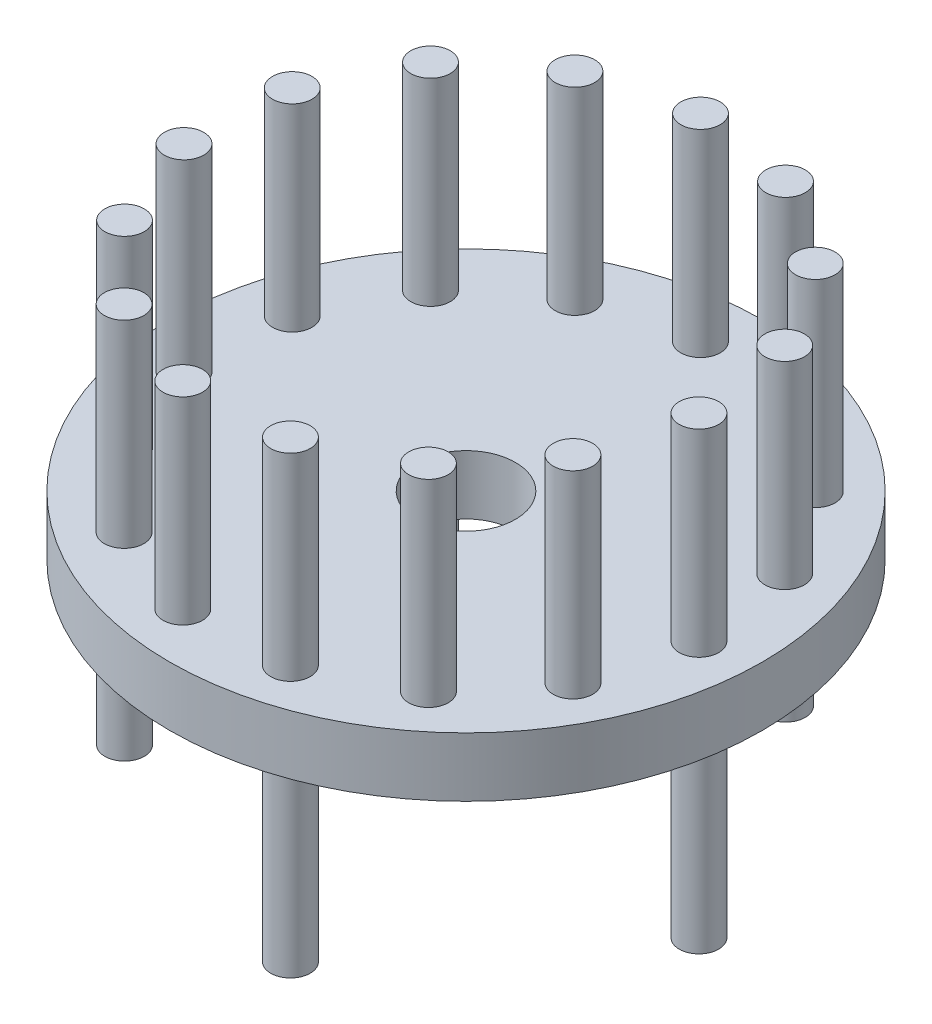
ISO-10303-21;
HEADER;
FILE_DESCRIPTION(('STEP AP214'),'2;1');
FILE_NAME('part.step','',(''),(''),'','','');
FILE_SCHEMA(('AUTOMOTIVE_DESIGN { 1 0 10303 214 1 1 1 1 }'));
ENDSEC;
DATA;
#1=APPLICATION_CONTEXT('core data for automotive mechanical design processes');
#2=APPLICATION_PROTOCOL_DEFINITION('international standard','automotive_design',2000,#1);
#3=PRODUCT_CONTEXT('',#1,'mechanical');
#4=PRODUCT('Part','Part','',(#3));
#5=PRODUCT_RELATED_PRODUCT_CATEGORY('part','',(#4));
#6=PRODUCT_DEFINITION_FORMATION('','',#4);
#7=PRODUCT_DEFINITION_CONTEXT('part definition',#1,'design');
#8=PRODUCT_DEFINITION('design','',#6,#7);
#9=PRODUCT_DEFINITION_SHAPE('','',#8);
#10=(LENGTH_UNIT() NAMED_UNIT(*) SI_UNIT(.MILLI.,.METRE.));
#11=(NAMED_UNIT(*) PLANE_ANGLE_UNIT() SI_UNIT($,.RADIAN.));
#12=(NAMED_UNIT(*) SI_UNIT($,.STERADIAN.) SOLID_ANGLE_UNIT());
#13=UNCERTAINTY_MEASURE_WITH_UNIT(LENGTH_MEASURE(1.E-05),#10,'distance_accuracy_value','');
#14=(GEOMETRIC_REPRESENTATION_CONTEXT(3) GLOBAL_UNCERTAINTY_ASSIGNED_CONTEXT((#13)) GLOBAL_UNIT_ASSIGNED_CONTEXT((#10,
#11,#12)) REPRESENTATION_CONTEXT('',''));
#15=CARTESIAN_POINT('',(0.,0.,0.));
#16=DIRECTION('',(0.,0.,1.));
#17=DIRECTION('',(1.,0.,0.));
#18=AXIS2_PLACEMENT_3D('',#15,#16,#17);
#19=CARTESIAN_POINT('',(0.,3.,0.));
#20=DIRECTION('',(0.,1.,0.));
#21=DIRECTION('',(0.,0.,1.));
#22=AXIS2_PLACEMENT_3D('',#19,#20,#21);
#23=PLANE('',#22);
#24=CARTESIAN_POINT('',(11.1206882965066,3.,5.70791483923351));
#25=DIRECTION('',(0.,1.,0.));
#26=DIRECTION('',(-0.406736643075789,0.,0.913545457642606));
#27=AXIS2_PLACEMENT_3D('',#24,#25,#26);
#28=CIRCLE('',#27,1.);
#29=CARTESIAN_POINT('',(10.7139516534308,3.,6.62146029687612));
#30=VERTEX_POINT('',#29);
#31=EDGE_CURVE('E152',#30,#30,#28,.T.);
#32=ORIENTED_EDGE('',*,*,#31,.F.);
#33=EDGE_LOOP('',(#32));
#34=FACE_BOUND('',#33,.T.);
#35=CARTESIAN_POINT('',(7.83763615846041,3.,9.73763110040599));
#36=DIRECTION('',(0.,1.,0.));
#37=DIRECTION('',(-0.743144825477386,0.,0.669130606358867));
#38=AXIS2_PLACEMENT_3D('',#35,#36,#37);
#39=CIRCLE('',#38,1.);
#40=CARTESIAN_POINT('',(7.09449133298302,3.,10.4067617067649));
#41=VERTEX_POINT('',#40);
#42=EDGE_CURVE('E146',#41,#41,#39,.T.);
#43=ORIENTED_EDGE('',*,*,#42,.F.);
#44=EDGE_LOOP('',(#43));
#45=FACE_BOUND('',#44,.T.);
#46=CARTESIAN_POINT('',(3.19938552592725,3.,12.0836224807169));
#47=DIRECTION('',(0.,1.,0.));
#48=DIRECTION('',(-0.95105651629515,0.,0.309016994374957));
#49=AXIS2_PLACEMENT_3D('',#46,#47,#48);
#50=CIRCLE('',#49,1.);
#51=CARTESIAN_POINT('',(2.2483290096321,3.,12.3926394750919));
#52=VERTEX_POINT('',#51);
#53=EDGE_CURVE('E140',#52,#52,#50,.T.);
#54=ORIENTED_EDGE('',*,*,#53,.F.);
#55=EDGE_LOOP('',(#54));
#56=FACE_BOUND('',#55,.T.);
#57=CARTESIAN_POINT('',(-1.99206792954376,3.,12.3402457578479));
#58=DIRECTION('',(0.,1.,0.));
#59=DIRECTION('',(-0.994521895368274,0.,-0.104528463267644));
#60=AXIS2_PLACEMENT_3D('',#57,#58,#59);
#61=CIRCLE('',#60,1.);
#62=CARTESIAN_POINT('',(-2.98658982491203,3.,12.2357172945803));
#63=VERTEX_POINT('',#62);
#64=EDGE_CURVE('E134',#63,#63,#61,.T.);
#65=ORIENTED_EDGE('',*,*,#64,.F.);
#66=EDGE_LOOP('',(#65));
#67=FACE_BOUND('',#66,.T.);
#68=CARTESIAN_POINT('',(-6.83907474262765,3.,10.4631284358337));
#69=DIRECTION('',(0.,1.,0.));
#70=DIRECTION('',(-0.866025403784443,0.,-0.499999999999992));
#71=AXIS2_PLACEMENT_3D('',#68,#69,#70);
#72=CIRCLE('',#71,1.);
#73=CARTESIAN_POINT('',(-7.70510014641209,3.,9.96312843583374));
#74=VERTEX_POINT('',#73);
#75=EDGE_CURVE('E128',#74,#74,#72,.T.);
#76=ORIENTED_EDGE('',*,*,#75,.F.);
#77=EDGE_LOOP('',(#76));
#78=FACE_BOUND('',#77,.T.);
#79=CARTESIAN_POINT('',(-10.5035434016677,3.,6.77684115272617));
#80=DIRECTION('',(0.,1.,0.));
#81=DIRECTION('',(-0.58778525229248,0.,-0.809016994374943));
#82=AXIS2_PLACEMENT_3D('',#79,#80,#81);
#83=CIRCLE('',#82,1.);
#84=CARTESIAN_POINT('',(-11.0913286539602,3.,5.96782415835123));
#85=VERTEX_POINT('',#84);
#86=EDGE_CURVE('E122',#85,#85,#83,.T.);
#87=ORIENTED_EDGE('',*,*,#86,.F.);
#88=EDGE_LOOP('',(#87));
#89=FACE_BOUND('',#88,.T.);
#90=CARTESIAN_POINT('',(-12.3518539848632,3.,1.91877646864314));
#91=DIRECTION('',(0.,1.,0.));
#92=DIRECTION('',(-0.207911690817766,0.,-0.978147600733804));
#93=AXIS2_PLACEMENT_3D('',#90,#91,#92);
#94=CIRCLE('',#93,1.);
#95=CARTESIAN_POINT('',(-12.559765675681,3.,0.940628867909331));
#96=VERTEX_POINT('',#95);
#97=EDGE_CURVE('E116',#96,#96,#94,.T.);
#98=ORIENTED_EDGE('',*,*,#97,.F.);
#99=EDGE_LOOP('',(#98));
#100=FACE_BOUND('',#99,.T.);
#101=CARTESIAN_POINT('',(-12.0644168010052,3.,-3.27106209840528));
#102=DIRECTION('',(0.,1.,0.));
#103=DIRECTION('',(0.207911690817753,0.,-0.978147600733807));
#104=AXIS2_PLACEMENT_3D('',#101,#102,#103);
#105=CIRCLE('',#104,1.);
#106=CARTESIAN_POINT('',(-11.8565051101874,3.,-4.24920969913908));
#107=VERTEX_POINT('',#106);
#108=EDGE_CURVE('E110',#107,#107,#105,.T.);
#109=ORIENTED_EDGE('',*,*,#108,.F.);
#110=EDGE_LOOP('',(#109));
#111=FACE_BOUND('',#110,.T.);
#112=CARTESIAN_POINT('',(-9.69093235046752,3.,-7.89530431197316));
#113=DIRECTION('',(0.,1.,0.));
#114=DIRECTION('',(0.587785252292469,0.,-0.80901699437495));
#115=AXIS2_PLACEMENT_3D('',#112,#113,#114);
#116=CIRCLE('',#115,1.);
#117=CARTESIAN_POINT('',(-9.10314709817505,3.,-8.70432130634811));
#118=VERTEX_POINT('',#117);
#119=EDGE_CURVE('E104',#118,#118,#116,.T.);
#120=ORIENTED_EDGE('',*,*,#119,.F.);
#121=EDGE_LOOP('',(#120));
#122=FACE_BOUND('',#121,.T.);
#123=CARTESIAN_POINT('',(-5.64179765717748,3.,-11.154376683413));
#124=DIRECTION('',(0.,1.,0.));
#125=DIRECTION('',(0.866025403784436,0.,-0.500000000000004));
#126=AXIS2_PLACEMENT_3D('',#123,#124,#125);
#127=CIRCLE('',#126,1.);
#128=CARTESIAN_POINT('',(-4.77577225339304,3.,-11.654376683413));
#129=VERTEX_POINT('',#128);
#130=EDGE_CURVE('E98',#129,#129,#127,.T.);
#131=ORIENTED_EDGE('',*,*,#130,.F.);
#132=EDGE_LOOP('',(#131));
#133=FACE_BOUND('',#132,.T.);
#134=CARTESIAN_POINT('',(-0.617144894838775,3.,-12.4847559919597));
#135=DIRECTION('',(0.,1.,0.));
#136=DIRECTION('',(0.994521895368273,0.,-0.104528463267657));
#137=AXIS2_PLACEMENT_3D('',#134,#135,#136);
#138=CIRCLE('',#137,1.);
#139=CARTESIAN_POINT('',(0.377377000529499,3.,-12.5892844552274));
#140=VERTEX_POINT('',#139);
#141=EDGE_CURVE('E92',#140,#140,#138,.T.);
#142=ORIENTED_EDGE('',*,*,#141,.F.);
#143=EDGE_LOOP('',(#142));
#144=FACE_BOUND('',#143,.T.);
#145=CARTESIAN_POINT('',(4.51421782640291,3.,-11.6564075690491));
#146=DIRECTION('',(0.,1.,0.));
#147=DIRECTION('',(0.951056516295154,0.,0.309016994374945));
#148=AXIS2_PLACEMENT_3D('',#145,#146,#147);
#149=CIRCLE('',#148,1.);
#150=CARTESIAN_POINT('',(5.46527434269807,3.,-11.3473905746742));
#151=VERTEX_POINT('',#150);
#152=EDGE_CURVE('E86',#151,#151,#149,.T.);
#153=ORIENTED_EDGE('',*,*,#152,.F.);
#154=EDGE_LOOP('',(#153));
#155=FACE_BOUND('',#154,.T.);
#156=CARTESIAN_POINT('',(8.86503127507804,3.,-8.81256038231161));
#157=DIRECTION('',(0.,1.,0.));
#158=DIRECTION('',(0.743144825477395,0.,0.669130606358857));
#159=AXIS2_PLACEMENT_3D('',#156,#157,#158);
#160=CIRCLE('',#159,1.);
#161=CARTESIAN_POINT('',(9.60817610055544,3.,-8.14342977595276));
#162=VERTEX_POINT('',#161);
#163=EDGE_CURVE('E80',#162,#162,#160,.T.);
#164=ORIENTED_EDGE('',*,*,#163,.F.);
#165=EDGE_LOOP('',(#164));
#166=FACE_BOUND('',#165,.T.);
#167=CARTESIAN_POINT('',(11.6830002800114,3.,-4.44494144587468));
#168=DIRECTION('',(0.,1.,0.));
#169=DIRECTION('',(0.406736643075801,0.,0.913545457642601));
#170=AXIS2_PLACEMENT_3D('',#167,#168,#169);
#171=CIRCLE('',#170,1.);
#172=CARTESIAN_POINT('',(12.0897369230872,3.,-3.53139598823208));
#173=VERTEX_POINT('',#172);
#174=EDGE_CURVE('E74',#173,#173,#171,.T.);
#175=ORIENTED_EDGE('',*,*,#174,.F.);
#176=EDGE_LOOP('',(#175));
#177=FACE_BOUND('',#176,.T.);
#178=CARTESIAN_POINT('',(12.4808723998052,3.,0.691248247579312));
#179=DIRECTION('',(0.,1.,0.));
#180=DIRECTION('',(0.,0.,1.));
#181=AXIS2_PLACEMENT_3D('',#178,#179,#180);
#182=CIRCLE('',#181,1.);
#183=CARTESIAN_POINT('',(12.4808723998052,3.,1.69124824757931));
#184=VERTEX_POINT('',#183);
#185=EDGE_CURVE('E68',#184,#184,#182,.T.);
#186=ORIENTED_EDGE('',*,*,#185,.F.);
#187=EDGE_LOOP('',(#186));
#188=FACE_BOUND('',#187,.T.);
#189=CARTESIAN_POINT('',(0.,3.,0.));
#190=DIRECTION('',(0.,1.,0.));
#191=DIRECTION('',(0.,0.,1.));
#192=AXIS2_PLACEMENT_3D('',#189,#190,#191);
#193=CIRCLE('',#192,15.);
#194=CARTESIAN_POINT('',(0.,3.,15.));
#195=VERTEX_POINT('',#194);
#196=EDGE_CURVE('E55',#195,#195,#193,.T.);
#197=ORIENTED_EDGE('',*,*,#196,.T.);
#198=EDGE_LOOP('',(#197));
#199=FACE_BOUND('',#198,.T.);
#200=CARTESIAN_POINT('',(0.,3.,0.));
#201=DIRECTION('',(0.,1.,0.));
#202=DIRECTION('',(0.,0.,1.));
#203=AXIS2_PLACEMENT_3D('',#200,#201,#202);
#204=CIRCLE('',#203,2.5);
#205=CARTESIAN_POINT('',(0.,3.,2.5));
#206=VERTEX_POINT('',#205);
#207=EDGE_CURVE('E59',#206,#206,#204,.T.);
#208=ORIENTED_EDGE('',*,*,#207,.F.);
#209=EDGE_LOOP('',(#208));
#210=FACE_BOUND('',#209,.T.);
#211=ADVANCED_FACE('F32',(#34,#45,#56,#67,#78,#89,#100,#111,#122,#133,#144,#155,#166,#177,#188,
#199,#210),#23,.T.);
#212=CARTESIAN_POINT('',(0.,0.,0.));
#213=DIRECTION('',(0.,1.,0.));
#214=DIRECTION('',(0.,0.,1.));
#215=AXIS2_PLACEMENT_3D('',#212,#213,#214);
#216=PLANE('',#215);
#217=CARTESIAN_POINT('',(4.51421782640307,0.,-11.6564075690491));
#218=DIRECTION('',(0.,1.,0.));
#219=DIRECTION('',(0.,0.,1.));
#220=AXIS2_PLACEMENT_3D('',#217,#218,#219);
#221=CIRCLE('',#220,1.);
#222=CARTESIAN_POINT('',(4.51421782640307,0.,-10.6564075690491));
#223=VERTEX_POINT('',#222);
#224=EDGE_CURVE('E10',#223,#223,#221,.F.);
#225=ORIENTED_EDGE('',*,*,#224,.F.);
#226=EDGE_LOOP('',(#225));
#227=FACE_BOUND('',#226,.T.);
#228=CARTESIAN_POINT('',(-9.69093235046741,0.,-7.8953043119733));
#229=DIRECTION('',(0.,1.,0.));
#230=DIRECTION('',(0.,0.,1.));
#231=AXIS2_PLACEMENT_3D('',#228,#229,#230);
#232=CIRCLE('',#231,1.);
#233=CARTESIAN_POINT('',(-9.69093235046741,0.,-6.8953043119733));
#234=VERTEX_POINT('',#233);
#235=EDGE_CURVE('E39',#234,#234,#232,.F.);
#236=ORIENTED_EDGE('',*,*,#235,.F.);
#237=EDGE_LOOP('',(#236));
#238=FACE_BOUND('',#237,.T.);
#239=CARTESIAN_POINT('',(-10.5035434016678,0.,6.77684115272602));
#240=DIRECTION('',(0.,1.,0.));
#241=DIRECTION('',(0.,0.,1.));
#242=AXIS2_PLACEMENT_3D('',#239,#240,#241);
#243=CIRCLE('',#242,1.);
#244=CARTESIAN_POINT('',(-10.5035434016678,0.,7.77684115272602));
#245=VERTEX_POINT('',#244);
#246=EDGE_CURVE('E43',#245,#245,#243,.F.);
#247=ORIENTED_EDGE('',*,*,#246,.F.);
#248=EDGE_LOOP('',(#247));
#249=FACE_BOUND('',#248,.T.);
#250=CARTESIAN_POINT('',(3.19938552592709,0.,12.083622480717));
#251=DIRECTION('',(0.,1.,0.));
#252=DIRECTION('',(0.,0.,1.));
#253=AXIS2_PLACEMENT_3D('',#250,#251,#252);
#254=CIRCLE('',#253,1.);
#255=CARTESIAN_POINT('',(3.19938552592709,0.,13.083622480717));
#256=VERTEX_POINT('',#255);
#257=EDGE_CURVE('E47',#256,#256,#254,.F.);
#258=ORIENTED_EDGE('',*,*,#257,.F.);
#259=EDGE_LOOP('',(#258));
#260=FACE_BOUND('',#259,.T.);
#261=CARTESIAN_POINT('',(12.4808723998052,0.,0.691248247579312));
#262=DIRECTION('',(0.,1.,0.));
#263=DIRECTION('',(0.,0.,1.));
#264=AXIS2_PLACEMENT_3D('',#261,#262,#263);
#265=CIRCLE('',#264,1.);
#266=CARTESIAN_POINT('',(12.4808723998052,0.,1.69124824757931));
#267=VERTEX_POINT('',#266);
#268=EDGE_CURVE('E52',#267,#267,#265,.F.);
#269=ORIENTED_EDGE('',*,*,#268,.F.);
#270=EDGE_LOOP('',(#269));
#271=FACE_BOUND('',#270,.T.);
#272=CARTESIAN_POINT('',(0.,0.,0.));
#273=DIRECTION('',(0.,1.,0.));
#274=DIRECTION('',(0.,0.,1.));
#275=AXIS2_PLACEMENT_3D('',#272,#273,#274);
#276=CIRCLE('',#275,15.);
#277=CARTESIAN_POINT('',(0.,0.,15.));
#278=VERTEX_POINT('',#277);
#279=EDGE_CURVE('E56',#278,#278,#276,.T.);
#280=ORIENTED_EDGE('',*,*,#279,.F.);
#281=EDGE_LOOP('',(#280));
#282=FACE_BOUND('',#281,.T.);
#283=CARTESIAN_POINT('',(0.,0.,0.));
#284=DIRECTION('',(0.,1.,0.));
#285=DIRECTION('',(0.,0.,1.));
#286=AXIS2_PLACEMENT_3D('',#283,#284,#285);
#287=CIRCLE('',#286,2.5);
#288=CARTESIAN_POINT('',(0.,0.,2.5));
#289=VERTEX_POINT('',#288);
#290=EDGE_CURVE('E62',#289,#289,#287,.T.);
#291=ORIENTED_EDGE('',*,*,#290,.T.);
#292=EDGE_LOOP('',(#291));
#293=FACE_BOUND('',#292,.T.);
#294=ADVANCED_FACE('F188',(#227,#238,#249,#260,#271,#282,#293),#216,.F.);
#295=CARTESIAN_POINT('',(0.,3.,0.));
#296=DIRECTION('',(0.,-1.,0.));
#297=DIRECTION('',(0.,0.,-1.));
#298=AXIS2_PLACEMENT_3D('',#295,#296,#297);
#299=CYLINDRICAL_SURFACE('',#298,15.);
#300=ORIENTED_EDGE('',*,*,#196,.F.);
#301=EDGE_LOOP('',(#300));
#302=FACE_BOUND('',#301,.T.);
#303=ORIENTED_EDGE('',*,*,#279,.T.);
#304=EDGE_LOOP('',(#303));
#305=FACE_BOUND('',#304,.T.);
#306=ADVANCED_FACE('F34',(#302,#305),#299,.T.);
#307=CARTESIAN_POINT('',(0.,3.,0.));
#308=DIRECTION('',(0.,-1.,0.));
#309=DIRECTION('',(0.,0.,-1.));
#310=AXIS2_PLACEMENT_3D('',#307,#308,#309);
#311=CYLINDRICAL_SURFACE('',#310,2.5);
#312=ORIENTED_EDGE('',*,*,#207,.T.);
#313=EDGE_LOOP('',(#312));
#314=FACE_BOUND('',#313,.T.);
#315=ORIENTED_EDGE('',*,*,#290,.F.);
#316=EDGE_LOOP('',(#315));
#317=FACE_BOUND('',#316,.T.);
#318=ADVANCED_FACE('F198',(#314,#317),#311,.F.);
#319=CARTESIAN_POINT('',(12.4808723998052,13.,0.691248247579312));
#320=DIRECTION('',(0.,-1.,0.));
#321=DIRECTION('',(0.,0.,-1.));
#322=AXIS2_PLACEMENT_3D('',#319,#320,#321);
#323=CYLINDRICAL_SURFACE('',#322,1.);
#324=CARTESIAN_POINT('',(12.4808723998052,13.,0.691248247579312));
#325=DIRECTION('',(0.,1.,0.));
#326=DIRECTION('',(0.,0.,1.));
#327=AXIS2_PLACEMENT_3D('',#324,#325,#326);
#328=CIRCLE('',#327,1.);
#329=CARTESIAN_POINT('',(12.4808723998052,13.,1.69124824757931));
#330=VERTEX_POINT('',#329);
#331=EDGE_CURVE('E65',#330,#330,#328,.T.);
#332=ORIENTED_EDGE('',*,*,#331,.F.);
#333=EDGE_LOOP('',(#332));
#334=FACE_BOUND('',#333,.T.);
#335=ORIENTED_EDGE('',*,*,#185,.T.);
#336=EDGE_LOOP('',(#335));
#337=FACE_BOUND('',#336,.T.);
#338=ADVANCED_FACE('F201',(#334,#337),#323,.T.);
#339=CARTESIAN_POINT('',(12.4808723998052,13.,0.691248247579312));
#340=DIRECTION('',(0.,1.,0.));
#341=DIRECTION('',(0.,0.,1.));
#342=AXIS2_PLACEMENT_3D('',#339,#340,#341);
#343=PLANE('',#342);
#344=ORIENTED_EDGE('',*,*,#331,.T.);
#345=EDGE_LOOP('',(#344));
#346=FACE_BOUND('',#345,.T.);
#347=ADVANCED_FACE('F205',(#346),#343,.T.);
#348=CARTESIAN_POINT('',(11.6830002800114,13.,-4.44494144587468));
#349=DIRECTION('',(0.,-1.,0.));
#350=DIRECTION('',(0.,0.,-1.));
#351=AXIS2_PLACEMENT_3D('',#348,#349,#350);
#352=CYLINDRICAL_SURFACE('',#351,1.);
#353=CARTESIAN_POINT('',(11.6830002800114,13.,-4.44494144587468));
#354=DIRECTION('',(0.,1.,0.));
#355=DIRECTION('',(0.406736643075801,0.,0.913545457642601));
#356=AXIS2_PLACEMENT_3D('',#353,#354,#355);
#357=CIRCLE('',#356,1.);
#358=CARTESIAN_POINT('',(12.0897369230872,13.,-3.53139598823208));
#359=VERTEX_POINT('',#358);
#360=EDGE_CURVE('E71',#359,#359,#357,.T.);
#361=ORIENTED_EDGE('',*,*,#360,.F.);
#362=EDGE_LOOP('',(#361));
#363=FACE_BOUND('',#362,.T.);
#364=ORIENTED_EDGE('',*,*,#174,.T.);
#365=EDGE_LOOP('',(#364));
#366=FACE_BOUND('',#365,.T.);
#367=ADVANCED_FACE('F209',(#363,#366),#352,.T.);
#368=CARTESIAN_POINT('',(11.6830002800114,13.,-4.44494144587468));
#369=DIRECTION('',(0.,1.,0.));
#370=DIRECTION('',(0.406736643075801,0.,0.913545457642601));
#371=AXIS2_PLACEMENT_3D('',#368,#369,#370);
#372=PLANE('',#371);
#373=ORIENTED_EDGE('',*,*,#360,.T.);
#374=EDGE_LOOP('',(#373));
#375=FACE_BOUND('',#374,.T.);
#376=ADVANCED_FACE('F213',(#375),#372,.T.);
#377=CARTESIAN_POINT('',(8.86503127507804,13.,-8.81256038231161));
#378=DIRECTION('',(0.,-1.,0.));
#379=DIRECTION('',(0.,0.,-1.));
#380=AXIS2_PLACEMENT_3D('',#377,#378,#379);
#381=CYLINDRICAL_SURFACE('',#380,1.);
#382=CARTESIAN_POINT('',(8.86503127507804,13.,-8.81256038231161));
#383=DIRECTION('',(0.,1.,0.));
#384=DIRECTION('',(0.743144825477395,0.,0.669130606358857));
#385=AXIS2_PLACEMENT_3D('',#382,#383,#384);
#386=CIRCLE('',#385,1.);
#387=CARTESIAN_POINT('',(9.60817610055544,13.,-8.14342977595276));
#388=VERTEX_POINT('',#387);
#389=EDGE_CURVE('E77',#388,#388,#386,.T.);
#390=ORIENTED_EDGE('',*,*,#389,.F.);
#391=EDGE_LOOP('',(#390));
#392=FACE_BOUND('',#391,.T.);
#393=ORIENTED_EDGE('',*,*,#163,.T.);
#394=EDGE_LOOP('',(#393));
#395=FACE_BOUND('',#394,.T.);
#396=ADVANCED_FACE('F217',(#392,#395),#381,.T.);
#397=CARTESIAN_POINT('',(8.86503127507804,13.,-8.81256038231161));
#398=DIRECTION('',(0.,1.,0.));
#399=DIRECTION('',(0.743144825477395,0.,0.669130606358857));
#400=AXIS2_PLACEMENT_3D('',#397,#398,#399);
#401=PLANE('',#400);
#402=ORIENTED_EDGE('',*,*,#389,.T.);
#403=EDGE_LOOP('',(#402));
#404=FACE_BOUND('',#403,.T.);
#405=ADVANCED_FACE('F221',(#404),#401,.T.);
#406=CARTESIAN_POINT('',(4.51421782640291,13.,-11.6564075690491));
#407=DIRECTION('',(0.,-1.,0.));
#408=DIRECTION('',(0.,0.,-1.));
#409=AXIS2_PLACEMENT_3D('',#406,#407,#408);
#410=CYLINDRICAL_SURFACE('',#409,1.);
#411=CARTESIAN_POINT('',(4.51421782640291,13.,-11.6564075690491));
#412=DIRECTION('',(0.,1.,0.));
#413=DIRECTION('',(0.951056516295154,0.,0.309016994374945));
#414=AXIS2_PLACEMENT_3D('',#411,#412,#413);
#415=CIRCLE('',#414,1.);
#416=CARTESIAN_POINT('',(5.46527434269807,13.,-11.3473905746742));
#417=VERTEX_POINT('',#416);
#418=EDGE_CURVE('E83',#417,#417,#415,.T.);
#419=ORIENTED_EDGE('',*,*,#418,.F.);
#420=EDGE_LOOP('',(#419));
#421=FACE_BOUND('',#420,.T.);
#422=ORIENTED_EDGE('',*,*,#152,.T.);
#423=EDGE_LOOP('',(#422));
#424=FACE_BOUND('',#423,.T.);
#425=ADVANCED_FACE('F225',(#421,#424),#410,.T.);
#426=CARTESIAN_POINT('',(4.51421782640291,13.,-11.6564075690491));
#427=DIRECTION('',(0.,1.,0.));
#428=DIRECTION('',(0.951056516295154,0.,0.309016994374945));
#429=AXIS2_PLACEMENT_3D('',#426,#427,#428);
#430=PLANE('',#429);
#431=ORIENTED_EDGE('',*,*,#418,.T.);
#432=EDGE_LOOP('',(#431));
#433=FACE_BOUND('',#432,.T.);
#434=ADVANCED_FACE('F229',(#433),#430,.T.);
#435=CARTESIAN_POINT('',(-0.617144894838775,13.,-12.4847559919597));
#436=DIRECTION('',(0.,-1.,0.));
#437=DIRECTION('',(0.,0.,-1.));
#438=AXIS2_PLACEMENT_3D('',#435,#436,#437);
#439=CYLINDRICAL_SURFACE('',#438,1.);
#440=CARTESIAN_POINT('',(-0.617144894838775,13.,-12.4847559919597));
#441=DIRECTION('',(0.,1.,0.));
#442=DIRECTION('',(0.994521895368273,0.,-0.104528463267657));
#443=AXIS2_PLACEMENT_3D('',#440,#441,#442);
#444=CIRCLE('',#443,1.);
#445=CARTESIAN_POINT('',(0.377377000529499,13.,-12.5892844552274));
#446=VERTEX_POINT('',#445);
#447=EDGE_CURVE('E89',#446,#446,#444,.T.);
#448=ORIENTED_EDGE('',*,*,#447,.F.);
#449=EDGE_LOOP('',(#448));
#450=FACE_BOUND('',#449,.T.);
#451=ORIENTED_EDGE('',*,*,#141,.T.);
#452=EDGE_LOOP('',(#451));
#453=FACE_BOUND('',#452,.T.);
#454=ADVANCED_FACE('F233',(#450,#453),#439,.T.);
#455=CARTESIAN_POINT('',(-0.617144894838775,13.,-12.4847559919597));
#456=DIRECTION('',(0.,1.,0.));
#457=DIRECTION('',(0.994521895368273,0.,-0.104528463267657));
#458=AXIS2_PLACEMENT_3D('',#455,#456,#457);
#459=PLANE('',#458);
#460=ORIENTED_EDGE('',*,*,#447,.T.);
#461=EDGE_LOOP('',(#460));
#462=FACE_BOUND('',#461,.T.);
#463=ADVANCED_FACE('F237',(#462),#459,.T.);
#464=CARTESIAN_POINT('',(-5.64179765717748,13.,-11.154376683413));
#465=DIRECTION('',(0.,-1.,0.));
#466=DIRECTION('',(0.,0.,-1.));
#467=AXIS2_PLACEMENT_3D('',#464,#465,#466);
#468=CYLINDRICAL_SURFACE('',#467,1.);
#469=CARTESIAN_POINT('',(-5.64179765717748,13.,-11.154376683413));
#470=DIRECTION('',(0.,1.,0.));
#471=DIRECTION('',(0.866025403784436,0.,-0.500000000000004));
#472=AXIS2_PLACEMENT_3D('',#469,#470,#471);
#473=CIRCLE('',#472,1.);
#474=CARTESIAN_POINT('',(-4.77577225339304,13.,-11.654376683413));
#475=VERTEX_POINT('',#474);
#476=EDGE_CURVE('E95',#475,#475,#473,.T.);
#477=ORIENTED_EDGE('',*,*,#476,.F.);
#478=EDGE_LOOP('',(#477));
#479=FACE_BOUND('',#478,.T.);
#480=ORIENTED_EDGE('',*,*,#130,.T.);
#481=EDGE_LOOP('',(#480));
#482=FACE_BOUND('',#481,.T.);
#483=ADVANCED_FACE('F241',(#479,#482),#468,.T.);
#484=CARTESIAN_POINT('',(-5.64179765717748,13.,-11.154376683413));
#485=DIRECTION('',(0.,1.,0.));
#486=DIRECTION('',(0.866025403784436,0.,-0.500000000000004));
#487=AXIS2_PLACEMENT_3D('',#484,#485,#486);
#488=PLANE('',#487);
#489=ORIENTED_EDGE('',*,*,#476,.T.);
#490=EDGE_LOOP('',(#489));
#491=FACE_BOUND('',#490,.T.);
#492=ADVANCED_FACE('F245',(#491),#488,.T.);
#493=CARTESIAN_POINT('',(-9.69093235046752,13.,-7.89530431197316));
#494=DIRECTION('',(0.,-1.,0.));
#495=DIRECTION('',(0.,0.,-1.));
#496=AXIS2_PLACEMENT_3D('',#493,#494,#495);
#497=CYLINDRICAL_SURFACE('',#496,1.);
#498=CARTESIAN_POINT('',(-9.69093235046752,13.,-7.89530431197316));
#499=DIRECTION('',(0.,1.,0.));
#500=DIRECTION('',(0.587785252292469,0.,-0.80901699437495));
#501=AXIS2_PLACEMENT_3D('',#498,#499,#500);
#502=CIRCLE('',#501,1.);
#503=CARTESIAN_POINT('',(-9.10314709817505,13.,-8.70432130634811));
#504=VERTEX_POINT('',#503);
#505=EDGE_CURVE('E101',#504,#504,#502,.T.);
#506=ORIENTED_EDGE('',*,*,#505,.F.);
#507=EDGE_LOOP('',(#506));
#508=FACE_BOUND('',#507,.T.);
#509=ORIENTED_EDGE('',*,*,#119,.T.);
#510=EDGE_LOOP('',(#509));
#511=FACE_BOUND('',#510,.T.);
#512=ADVANCED_FACE('F249',(#508,#511),#497,.T.);
#513=CARTESIAN_POINT('',(-9.69093235046752,13.,-7.89530431197316));
#514=DIRECTION('',(0.,1.,0.));
#515=DIRECTION('',(0.587785252292469,0.,-0.80901699437495));
#516=AXIS2_PLACEMENT_3D('',#513,#514,#515);
#517=PLANE('',#516);
#518=ORIENTED_EDGE('',*,*,#505,.T.);
#519=EDGE_LOOP('',(#518));
#520=FACE_BOUND('',#519,.T.);
#521=ADVANCED_FACE('F253',(#520),#517,.T.);
#522=CARTESIAN_POINT('',(-12.0644168010052,13.,-3.27106209840528));
#523=DIRECTION('',(0.,-1.,0.));
#524=DIRECTION('',(0.,0.,-1.));
#525=AXIS2_PLACEMENT_3D('',#522,#523,#524);
#526=CYLINDRICAL_SURFACE('',#525,1.);
#527=CARTESIAN_POINT('',(-12.0644168010052,13.,-3.27106209840528));
#528=DIRECTION('',(0.,1.,0.));
#529=DIRECTION('',(0.207911690817753,0.,-0.978147600733807));
#530=AXIS2_PLACEMENT_3D('',#527,#528,#529);
#531=CIRCLE('',#530,1.);
#532=CARTESIAN_POINT('',(-11.8565051101874,13.,-4.24920969913908));
#533=VERTEX_POINT('',#532);
#534=EDGE_CURVE('E107',#533,#533,#531,.T.);
#535=ORIENTED_EDGE('',*,*,#534,.F.);
#536=EDGE_LOOP('',(#535));
#537=FACE_BOUND('',#536,.T.);
#538=ORIENTED_EDGE('',*,*,#108,.T.);
#539=EDGE_LOOP('',(#538));
#540=FACE_BOUND('',#539,.T.);
#541=ADVANCED_FACE('F257',(#537,#540),#526,.T.);
#542=CARTESIAN_POINT('',(-12.0644168010052,13.,-3.27106209840528));
#543=DIRECTION('',(0.,1.,0.));
#544=DIRECTION('',(0.207911690817753,0.,-0.978147600733807));
#545=AXIS2_PLACEMENT_3D('',#542,#543,#544);
#546=PLANE('',#545);
#547=ORIENTED_EDGE('',*,*,#534,.T.);
#548=EDGE_LOOP('',(#547));
#549=FACE_BOUND('',#548,.T.);
#550=ADVANCED_FACE('F261',(#549),#546,.T.);
#551=CARTESIAN_POINT('',(-12.3518539848632,13.,1.91877646864314));
#552=DIRECTION('',(0.,-1.,0.));
#553=DIRECTION('',(0.,0.,-1.));
#554=AXIS2_PLACEMENT_3D('',#551,#552,#553);
#555=CYLINDRICAL_SURFACE('',#554,1.);
#556=CARTESIAN_POINT('',(-12.3518539848632,13.,1.91877646864314));
#557=DIRECTION('',(0.,1.,0.));
#558=DIRECTION('',(-0.207911690817766,0.,-0.978147600733804));
#559=AXIS2_PLACEMENT_3D('',#556,#557,#558);
#560=CIRCLE('',#559,1.);
#561=CARTESIAN_POINT('',(-12.559765675681,13.,0.940628867909331));
#562=VERTEX_POINT('',#561);
#563=EDGE_CURVE('E113',#562,#562,#560,.T.);
#564=ORIENTED_EDGE('',*,*,#563,.F.);
#565=EDGE_LOOP('',(#564));
#566=FACE_BOUND('',#565,.T.);
#567=ORIENTED_EDGE('',*,*,#97,.T.);
#568=EDGE_LOOP('',(#567));
#569=FACE_BOUND('',#568,.T.);
#570=ADVANCED_FACE('F265',(#566,#569),#555,.T.);
#571=CARTESIAN_POINT('',(-12.3518539848632,13.,1.91877646864314));
#572=DIRECTION('',(0.,1.,0.));
#573=DIRECTION('',(-0.207911690817766,0.,-0.978147600733804));
#574=AXIS2_PLACEMENT_3D('',#571,#572,#573);
#575=PLANE('',#574);
#576=ORIENTED_EDGE('',*,*,#563,.T.);
#577=EDGE_LOOP('',(#576));
#578=FACE_BOUND('',#577,.T.);
#579=ADVANCED_FACE('F269',(#578),#575,.T.);
#580=CARTESIAN_POINT('',(-10.5035434016677,13.,6.77684115272617));
#581=DIRECTION('',(0.,-1.,0.));
#582=DIRECTION('',(0.,0.,-1.));
#583=AXIS2_PLACEMENT_3D('',#580,#581,#582);
#584=CYLINDRICAL_SURFACE('',#583,1.);
#585=CARTESIAN_POINT('',(-10.5035434016677,13.,6.77684115272617));
#586=DIRECTION('',(0.,1.,0.));
#587=DIRECTION('',(-0.58778525229248,0.,-0.809016994374943));
#588=AXIS2_PLACEMENT_3D('',#585,#586,#587);
#589=CIRCLE('',#588,1.);
#590=CARTESIAN_POINT('',(-11.0913286539602,13.,5.96782415835123));
#591=VERTEX_POINT('',#590);
#592=EDGE_CURVE('E119',#591,#591,#589,.T.);
#593=ORIENTED_EDGE('',*,*,#592,.F.);
#594=EDGE_LOOP('',(#593));
#595=FACE_BOUND('',#594,.T.);
#596=ORIENTED_EDGE('',*,*,#86,.T.);
#597=EDGE_LOOP('',(#596));
#598=FACE_BOUND('',#597,.T.);
#599=ADVANCED_FACE('F273',(#595,#598),#584,.T.);
#600=CARTESIAN_POINT('',(-10.5035434016677,13.,6.77684115272617));
#601=DIRECTION('',(0.,1.,0.));
#602=DIRECTION('',(-0.58778525229248,0.,-0.809016994374943));
#603=AXIS2_PLACEMENT_3D('',#600,#601,#602);
#604=PLANE('',#603);
#605=ORIENTED_EDGE('',*,*,#592,.T.);
#606=EDGE_LOOP('',(#605));
#607=FACE_BOUND('',#606,.T.);
#608=ADVANCED_FACE('F277',(#607),#604,.T.);
#609=CARTESIAN_POINT('',(-6.83907474262765,13.,10.4631284358337));
#610=DIRECTION('',(0.,-1.,0.));
#611=DIRECTION('',(0.,0.,-1.));
#612=AXIS2_PLACEMENT_3D('',#609,#610,#611);
#613=CYLINDRICAL_SURFACE('',#612,1.);
#614=CARTESIAN_POINT('',(-6.83907474262765,13.,10.4631284358337));
#615=DIRECTION('',(0.,1.,0.));
#616=DIRECTION('',(-0.866025403784443,0.,-0.499999999999992));
#617=AXIS2_PLACEMENT_3D('',#614,#615,#616);
#618=CIRCLE('',#617,1.);
#619=CARTESIAN_POINT('',(-7.70510014641209,13.,9.96312843583374));
#620=VERTEX_POINT('',#619);
#621=EDGE_CURVE('E125',#620,#620,#618,.T.);
#622=ORIENTED_EDGE('',*,*,#621,.F.);
#623=EDGE_LOOP('',(#622));
#624=FACE_BOUND('',#623,.T.);
#625=ORIENTED_EDGE('',*,*,#75,.T.);
#626=EDGE_LOOP('',(#625));
#627=FACE_BOUND('',#626,.T.);
#628=ADVANCED_FACE('F281',(#624,#627),#613,.T.);
#629=CARTESIAN_POINT('',(-6.83907474262765,13.,10.4631284358337));
#630=DIRECTION('',(0.,1.,0.));
#631=DIRECTION('',(-0.866025403784443,0.,-0.499999999999992));
#632=AXIS2_PLACEMENT_3D('',#629,#630,#631);
#633=PLANE('',#632);
#634=ORIENTED_EDGE('',*,*,#621,.T.);
#635=EDGE_LOOP('',(#634));
#636=FACE_BOUND('',#635,.T.);
#637=ADVANCED_FACE('F285',(#636),#633,.T.);
#638=CARTESIAN_POINT('',(-1.99206792954376,13.,12.3402457578479));
#639=DIRECTION('',(0.,-1.,0.));
#640=DIRECTION('',(0.,0.,-1.));
#641=AXIS2_PLACEMENT_3D('',#638,#639,#640);
#642=CYLINDRICAL_SURFACE('',#641,1.);
#643=CARTESIAN_POINT('',(-1.99206792954376,13.,12.3402457578479));
#644=DIRECTION('',(0.,1.,0.));
#645=DIRECTION('',(-0.994521895368274,0.,-0.104528463267644));
#646=AXIS2_PLACEMENT_3D('',#643,#644,#645);
#647=CIRCLE('',#646,1.);
#648=CARTESIAN_POINT('',(-2.98658982491203,13.,12.2357172945803));
#649=VERTEX_POINT('',#648);
#650=EDGE_CURVE('E131',#649,#649,#647,.T.);
#651=ORIENTED_EDGE('',*,*,#650,.F.);
#652=EDGE_LOOP('',(#651));
#653=FACE_BOUND('',#652,.T.);
#654=ORIENTED_EDGE('',*,*,#64,.T.);
#655=EDGE_LOOP('',(#654));
#656=FACE_BOUND('',#655,.T.);
#657=ADVANCED_FACE('F289',(#653,#656),#642,.T.);
#658=CARTESIAN_POINT('',(-1.99206792954376,13.,12.3402457578479));
#659=DIRECTION('',(0.,1.,0.));
#660=DIRECTION('',(-0.994521895368274,0.,-0.104528463267644));
#661=AXIS2_PLACEMENT_3D('',#658,#659,#660);
#662=PLANE('',#661);
#663=ORIENTED_EDGE('',*,*,#650,.T.);
#664=EDGE_LOOP('',(#663));
#665=FACE_BOUND('',#664,.T.);
#666=ADVANCED_FACE('F293',(#665),#662,.T.);
#667=CARTESIAN_POINT('',(3.19938552592725,13.,12.0836224807169));
#668=DIRECTION('',(0.,-1.,0.));
#669=DIRECTION('',(0.,0.,-1.));
#670=AXIS2_PLACEMENT_3D('',#667,#668,#669);
#671=CYLINDRICAL_SURFACE('',#670,1.);
#672=CARTESIAN_POINT('',(3.19938552592725,13.,12.0836224807169));
#673=DIRECTION('',(0.,1.,0.));
#674=DIRECTION('',(-0.95105651629515,0.,0.309016994374957));
#675=AXIS2_PLACEMENT_3D('',#672,#673,#674);
#676=CIRCLE('',#675,1.);
#677=CARTESIAN_POINT('',(2.2483290096321,13.,12.3926394750919));
#678=VERTEX_POINT('',#677);
#679=EDGE_CURVE('E137',#678,#678,#676,.T.);
#680=ORIENTED_EDGE('',*,*,#679,.F.);
#681=EDGE_LOOP('',(#680));
#682=FACE_BOUND('',#681,.T.);
#683=ORIENTED_EDGE('',*,*,#53,.T.);
#684=EDGE_LOOP('',(#683));
#685=FACE_BOUND('',#684,.T.);
#686=ADVANCED_FACE('F297',(#682,#685),#671,.T.);
#687=CARTESIAN_POINT('',(3.19938552592725,13.,12.0836224807169));
#688=DIRECTION('',(0.,1.,0.));
#689=DIRECTION('',(-0.95105651629515,0.,0.309016994374957));
#690=AXIS2_PLACEMENT_3D('',#687,#688,#689);
#691=PLANE('',#690);
#692=ORIENTED_EDGE('',*,*,#679,.T.);
#693=EDGE_LOOP('',(#692));
#694=FACE_BOUND('',#693,.T.);
#695=ADVANCED_FACE('F301',(#694),#691,.T.);
#696=CARTESIAN_POINT('',(7.83763615846041,13.,9.73763110040599));
#697=DIRECTION('',(0.,-1.,0.));
#698=DIRECTION('',(0.,0.,-1.));
#699=AXIS2_PLACEMENT_3D('',#696,#697,#698);
#700=CYLINDRICAL_SURFACE('',#699,1.);
#701=CARTESIAN_POINT('',(7.83763615846041,13.,9.73763110040599));
#702=DIRECTION('',(0.,1.,0.));
#703=DIRECTION('',(-0.743144825477386,0.,0.669130606358867));
#704=AXIS2_PLACEMENT_3D('',#701,#702,#703);
#705=CIRCLE('',#704,1.);
#706=CARTESIAN_POINT('',(7.09449133298302,13.,10.4067617067649));
#707=VERTEX_POINT('',#706);
#708=EDGE_CURVE('E143',#707,#707,#705,.T.);
#709=ORIENTED_EDGE('',*,*,#708,.F.);
#710=EDGE_LOOP('',(#709));
#711=FACE_BOUND('',#710,.T.);
#712=ORIENTED_EDGE('',*,*,#42,.T.);
#713=EDGE_LOOP('',(#712));
#714=FACE_BOUND('',#713,.T.);
#715=ADVANCED_FACE('F305',(#711,#714),#700,.T.);
#716=CARTESIAN_POINT('',(7.83763615846041,13.,9.73763110040599));
#717=DIRECTION('',(0.,1.,0.));
#718=DIRECTION('',(-0.743144825477386,0.,0.669130606358867));
#719=AXIS2_PLACEMENT_3D('',#716,#717,#718);
#720=PLANE('',#719);
#721=ORIENTED_EDGE('',*,*,#708,.T.);
#722=EDGE_LOOP('',(#721));
#723=FACE_BOUND('',#722,.T.);
#724=ADVANCED_FACE('F309',(#723),#720,.T.);
#725=CARTESIAN_POINT('',(11.1206882965066,13.,5.70791483923351));
#726=DIRECTION('',(0.,-1.,0.));
#727=DIRECTION('',(0.,0.,-1.));
#728=AXIS2_PLACEMENT_3D('',#725,#726,#727);
#729=CYLINDRICAL_SURFACE('',#728,1.);
#730=CARTESIAN_POINT('',(11.1206882965066,13.,5.70791483923351));
#731=DIRECTION('',(0.,1.,0.));
#732=DIRECTION('',(-0.406736643075789,0.,0.913545457642606));
#733=AXIS2_PLACEMENT_3D('',#730,#731,#732);
#734=CIRCLE('',#733,1.);
#735=CARTESIAN_POINT('',(10.7139516534308,13.,6.62146029687612));
#736=VERTEX_POINT('',#735);
#737=EDGE_CURVE('E149',#736,#736,#734,.T.);
#738=ORIENTED_EDGE('',*,*,#737,.F.);
#739=EDGE_LOOP('',(#738));
#740=FACE_BOUND('',#739,.T.);
#741=ORIENTED_EDGE('',*,*,#31,.T.);
#742=EDGE_LOOP('',(#741));
#743=FACE_BOUND('',#742,.T.);
#744=ADVANCED_FACE('F313',(#740,#743),#729,.T.);
#745=CARTESIAN_POINT('',(11.1206882965066,13.,5.70791483923351));
#746=DIRECTION('',(0.,1.,0.));
#747=DIRECTION('',(-0.406736643075789,0.,0.913545457642606));
#748=AXIS2_PLACEMENT_3D('',#745,#746,#747);
#749=PLANE('',#748);
#750=ORIENTED_EDGE('',*,*,#737,.T.);
#751=EDGE_LOOP('',(#750));
#752=FACE_BOUND('',#751,.T.);
#753=ADVANCED_FACE('F317',(#752),#749,.T.);
#754=CARTESIAN_POINT('',(12.4808723998052,-10.,0.691248247579312));
#755=DIRECTION('',(0.,1.,0.));
#756=DIRECTION('',(0.,0.,1.));
#757=AXIS2_PLACEMENT_3D('',#754,#755,#756);
#758=CYLINDRICAL_SURFACE('',#757,1.);
#759=CARTESIAN_POINT('',(12.4808723998052,-10.,0.691248247579312));
#760=DIRECTION('',(0.,-1.,0.));
#761=DIRECTION('',(0.,0.,-1.));
#762=AXIS2_PLACEMENT_3D('',#759,#760,#761);
#763=CIRCLE('',#762,1.);
#764=CARTESIAN_POINT('',(12.4808723998052,-10.,-0.308751752420687));
#765=VERTEX_POINT('',#764);
#766=EDGE_CURVE('E155',#765,#765,#763,.T.);
#767=ORIENTED_EDGE('',*,*,#766,.F.);
#768=EDGE_LOOP('',(#767));
#769=FACE_BOUND('',#768,.T.);
#770=ORIENTED_EDGE('',*,*,#268,.T.);
#771=EDGE_LOOP('',(#770));
#772=FACE_BOUND('',#771,.T.);
#773=ADVANCED_FACE('F321',(#769,#772),#758,.T.);
#774=CARTESIAN_POINT('',(12.4808723998052,-10.,0.691248247579312));
#775=DIRECTION('',(0.,-1.,0.));
#776=DIRECTION('',(0.,0.,-1.));
#777=AXIS2_PLACEMENT_3D('',#774,#775,#776);
#778=PLANE('',#777);
#779=ORIENTED_EDGE('',*,*,#766,.T.);
#780=EDGE_LOOP('',(#779));
#781=FACE_BOUND('',#780,.T.);
#782=ADVANCED_FACE('F325',(#781),#778,.T.);
#783=CARTESIAN_POINT('',(3.19938552592709,-10.,12.083622480717));
#784=DIRECTION('',(0.,1.,0.));
#785=DIRECTION('',(0.,0.,1.));
#786=AXIS2_PLACEMENT_3D('',#783,#784,#785);
#787=CYLINDRICAL_SURFACE('',#786,1.);
#788=CARTESIAN_POINT('',(3.19938552592709,-10.,12.083622480717));
#789=DIRECTION('',(0.,-1.,0.));
#790=DIRECTION('',(0.951056516295155,0.,-0.309016994374945));
#791=AXIS2_PLACEMENT_3D('',#788,#789,#790);
#792=CIRCLE('',#791,1.);
#793=CARTESIAN_POINT('',(4.15044204222224,-10.,11.774605486342));
#794=VERTEX_POINT('',#793);
#795=EDGE_CURVE('E160',#794,#794,#792,.T.);
#796=ORIENTED_EDGE('',*,*,#795,.F.);
#797=EDGE_LOOP('',(#796));
#798=FACE_BOUND('',#797,.T.);
#799=ORIENTED_EDGE('',*,*,#257,.T.);
#800=EDGE_LOOP('',(#799));
#801=FACE_BOUND('',#800,.T.);
#802=ADVANCED_FACE('F329',(#798,#801),#787,.T.);
#803=CARTESIAN_POINT('',(3.19938552592709,-10.,12.083622480717));
#804=DIRECTION('',(0.,-1.,0.));
#805=DIRECTION('',(0.951056516295155,0.,-0.309016994374945));
#806=AXIS2_PLACEMENT_3D('',#803,#804,#805);
#807=PLANE('',#806);
#808=ORIENTED_EDGE('',*,*,#795,.T.);
#809=EDGE_LOOP('',(#808));
#810=FACE_BOUND('',#809,.T.);
#811=ADVANCED_FACE('F333',(#810),#807,.T.);
#812=CARTESIAN_POINT('',(-10.5035434016678,-10.,6.77684115272602));
#813=DIRECTION('',(0.,1.,0.));
#814=DIRECTION('',(0.,0.,1.));
#815=AXIS2_PLACEMENT_3D('',#812,#813,#814);
#816=CYLINDRICAL_SURFACE('',#815,1.);
#817=CARTESIAN_POINT('',(-10.5035434016678,-10.,6.77684115272602));
#818=DIRECTION('',(0.,-1.,0.));
#819=DIRECTION('',(0.587785252292469,0.,0.809016994374951));
#820=AXIS2_PLACEMENT_3D('',#817,#818,#819);
#821=CIRCLE('',#820,1.);
#822=CARTESIAN_POINT('',(-9.91575814937532,-10.,7.58585814710097));
#823=VERTEX_POINT('',#822);
#824=EDGE_CURVE('E163',#823,#823,#821,.T.);
#825=ORIENTED_EDGE('',*,*,#824,.F.);
#826=EDGE_LOOP('',(#825));
#827=FACE_BOUND('',#826,.T.);
#828=ORIENTED_EDGE('',*,*,#246,.T.);
#829=EDGE_LOOP('',(#828));
#830=FACE_BOUND('',#829,.T.);
#831=ADVANCED_FACE('F337',(#827,#830),#816,.T.);
#832=CARTESIAN_POINT('',(-10.5035434016678,-10.,6.77684115272602));
#833=DIRECTION('',(0.,-1.,0.));
#834=DIRECTION('',(0.587785252292469,0.,0.809016994374951));
#835=AXIS2_PLACEMENT_3D('',#832,#833,#834);
#836=PLANE('',#835);
#837=ORIENTED_EDGE('',*,*,#824,.T.);
#838=EDGE_LOOP('',(#837));
#839=FACE_BOUND('',#838,.T.);
#840=ADVANCED_FACE('F341',(#839),#836,.T.);
#841=CARTESIAN_POINT('',(-9.69093235046741,-10.,-7.8953043119733));
#842=DIRECTION('',(0.,1.,0.));
#843=DIRECTION('',(0.,0.,1.));
#844=AXIS2_PLACEMENT_3D('',#841,#842,#843);
#845=CYLINDRICAL_SURFACE('',#844,1.);
#846=CARTESIAN_POINT('',(-9.69093235046741,-10.,-7.8953043119733));
#847=DIRECTION('',(0.,-1.,0.));
#848=DIRECTION('',(-0.58778525229248,0.,0.809016994374942));
#849=AXIS2_PLACEMENT_3D('',#846,#847,#848);
#850=CIRCLE('',#849,1.);
#851=CARTESIAN_POINT('',(-10.2787176027599,-10.,-7.08628731759836));
#852=VERTEX_POINT('',#851);
#853=EDGE_CURVE('E166',#852,#852,#850,.T.);
#854=ORIENTED_EDGE('',*,*,#853,.F.);
#855=EDGE_LOOP('',(#854));
#856=FACE_BOUND('',#855,.T.);
#857=ORIENTED_EDGE('',*,*,#235,.T.);
#858=EDGE_LOOP('',(#857));
#859=FACE_BOUND('',#858,.T.);
#860=ADVANCED_FACE('F184',(#856,#859),#845,.T.);
#861=CARTESIAN_POINT('',(-9.69093235046741,-10.,-7.8953043119733));
#862=DIRECTION('',(0.,-1.,0.));
#863=DIRECTION('',(-0.58778525229248,0.,0.809016994374942));
#864=AXIS2_PLACEMENT_3D('',#861,#862,#863);
#865=PLANE('',#864);
#866=ORIENTED_EDGE('',*,*,#853,.T.);
#867=EDGE_LOOP('',(#866));
#868=FACE_BOUND('',#867,.T.);
#869=ADVANCED_FACE('F177',(#868),#865,.T.);
#870=CARTESIAN_POINT('',(4.51421782640307,-10.,-11.6564075690491));
#871=DIRECTION('',(0.,1.,0.));
#872=DIRECTION('',(0.,0.,1.));
#873=AXIS2_PLACEMENT_3D('',#870,#871,#872);
#874=CYLINDRICAL_SURFACE('',#873,1.);
#875=CARTESIAN_POINT('',(4.51421782640307,-10.,-11.6564075690491));
#876=DIRECTION('',(0.,-1.,0.));
#877=DIRECTION('',(-0.95105651629515,0.,-0.309016994374958));
#878=AXIS2_PLACEMENT_3D('',#875,#876,#877);
#879=CIRCLE('',#878,1.);
#880=CARTESIAN_POINT('',(3.56316131010792,-10.,-11.965424563424));
#881=VERTEX_POINT('',#880);
#882=EDGE_CURVE('E169',#881,#881,#879,.T.);
#883=ORIENTED_EDGE('',*,*,#882,.F.);
#884=EDGE_LOOP('',(#883));
#885=FACE_BOUND('',#884,.T.);
#886=ORIENTED_EDGE('',*,*,#224,.T.);
#887=EDGE_LOOP('',(#886));
#888=FACE_BOUND('',#887,.T.);
#889=ADVANCED_FACE('F175',(#885,#888),#874,.T.);
#890=CARTESIAN_POINT('',(4.51421782640307,-10.,-11.6564075690491));
#891=DIRECTION('',(0.,-1.,0.));
#892=DIRECTION('',(-0.95105651629515,0.,-0.309016994374958));
#893=AXIS2_PLACEMENT_3D('',#890,#891,#892);
#894=PLANE('',#893);
#895=ORIENTED_EDGE('',*,*,#882,.T.);
#896=EDGE_LOOP('',(#895));
#897=FACE_BOUND('',#896,.T.);
#898=ADVANCED_FACE('F173',(#897),#894,.T.);
#899=CLOSED_SHELL('',(#211,#294,#306,#318,#338,#347,#367,#376,#396,#405,#425,#434,#454,#463,
#483,#492,#512,#521,#541,#550,#570,#579,#599,#608,#628,#637,#657,#666,#686,#695,#715,#724,#744,
#753,#773,#782,#802,#811,#831,#840,#860,#869,#889,#898));
#900=MANIFOLD_SOLID_BREP('B2',#899);
#901=ADVANCED_BREP_SHAPE_REPRESENTATION('',(#18,#900),#14);
#902=SHAPE_DEFINITION_REPRESENTATION(#9,#901);
ENDSEC;
END-ISO-10303-21;
